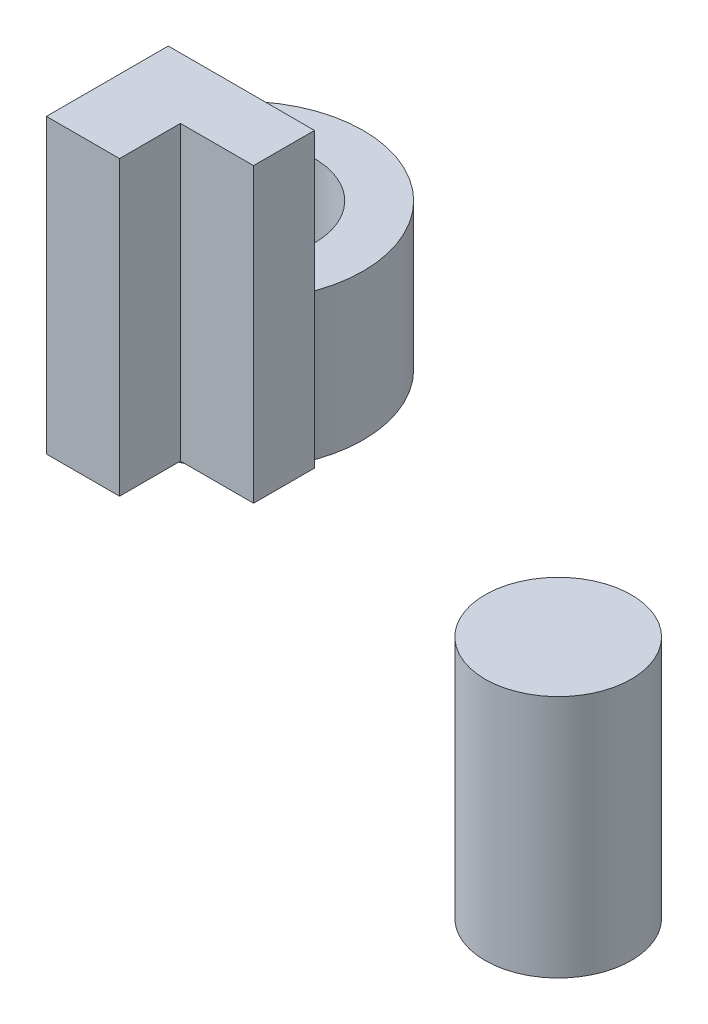
ISO-10303-21;
HEADER;
FILE_DESCRIPTION(('STEP AP214'),'2;1');
FILE_NAME('part.step','',(''),(''),'','','');
FILE_SCHEMA(('AUTOMOTIVE_DESIGN { 1 0 10303 214 1 1 1 1 }'));
ENDSEC;
DATA;
#1=APPLICATION_CONTEXT('core data for automotive mechanical design processes');
#2=APPLICATION_PROTOCOL_DEFINITION('international standard','automotive_design',2000,#1);
#3=PRODUCT_CONTEXT('',#1,'mechanical');
#4=PRODUCT('Part','Part','',(#3));
#5=PRODUCT_RELATED_PRODUCT_CATEGORY('part','',(#4));
#6=PRODUCT_DEFINITION_FORMATION('','',#4);
#7=PRODUCT_DEFINITION_CONTEXT('part definition',#1,'design');
#8=PRODUCT_DEFINITION('design','',#6,#7);
#9=PRODUCT_DEFINITION_SHAPE('','',#8);
#10=(LENGTH_UNIT() NAMED_UNIT(*) SI_UNIT(.MILLI.,.METRE.));
#11=(NAMED_UNIT(*) PLANE_ANGLE_UNIT() SI_UNIT($,.RADIAN.));
#12=(NAMED_UNIT(*) SI_UNIT($,.STERADIAN.) SOLID_ANGLE_UNIT());
#13=UNCERTAINTY_MEASURE_WITH_UNIT(LENGTH_MEASURE(1.E-05),#10,'distance_accuracy_value','');
#14=(GEOMETRIC_REPRESENTATION_CONTEXT(3) GLOBAL_UNCERTAINTY_ASSIGNED_CONTEXT((#13)) GLOBAL_UNIT_ASSIGNED_CONTEXT((#10,
#11,#12)) REPRESENTATION_CONTEXT('',''));
#15=CARTESIAN_POINT('',(0.,0.,0.));
#16=DIRECTION('',(0.,0.,1.));
#17=DIRECTION('',(1.,0.,0.));
#18=AXIS2_PLACEMENT_3D('',#15,#16,#17);
#19=CARTESIAN_POINT('',(0.,85.8555714935405,0.));
#20=DIRECTION('',(0.,1.,0.));
#21=DIRECTION('',(0.,0.,1.));
#22=AXIS2_PLACEMENT_3D('',#19,#20,#21);
#23=CYLINDRICAL_SURFACE('',#22,15.);
#24=CARTESIAN_POINT('',(0.,15.,0.));
#25=DIRECTION('',(0.,1.,0.));
#26=DIRECTION('',(0.,0.,1.));
#27=AXIS2_PLACEMENT_3D('',#24,#25,#26);
#28=CIRCLE('',#27,15.);
#29=CARTESIAN_POINT('',(0.,15.,15.));
#30=VERTEX_POINT('',#29);
#31=EDGE_CURVE('E11',#30,#30,#28,.T.);
#32=ORIENTED_EDGE('',*,*,#31,.F.);
#33=EDGE_LOOP('',(#32));
#34=FACE_BOUND('',#33,.T.);
#35=CARTESIAN_POINT('',(0.,45.,0.));
#36=DIRECTION('',(0.,1.,0.));
#37=DIRECTION('',(0.,0.,1.));
#38=AXIS2_PLACEMENT_3D('',#35,#36,#37);
#39=CIRCLE('',#38,15.);
#40=CARTESIAN_POINT('',(0.,45.,15.));
#41=VERTEX_POINT('',#40);
#42=EDGE_CURVE('E67',#41,#41,#39,.T.);
#43=ORIENTED_EDGE('',*,*,#42,.T.);
#44=EDGE_LOOP('',(#43));
#45=FACE_BOUND('',#44,.T.);
#46=ADVANCED_FACE('F50',(#34,#45),#23,.F.);
#47=CARTESIAN_POINT('',(15.,15.,0.));
#48=DIRECTION('',(0.,1.,0.));
#49=DIRECTION('',(0.,0.,1.));
#50=AXIS2_PLACEMENT_3D('',#47,#48,#49);
#51=PLANE('',#50);
#52=CARTESIAN_POINT('',(0.,15.,0.));
#53=DIRECTION('',(0.,1.,0.));
#54=DIRECTION('',(0.,0.,1.));
#55=AXIS2_PLACEMENT_3D('',#52,#53,#54);
#56=CIRCLE('',#55,25.);
#57=CARTESIAN_POINT('',(0.,15.,25.));
#58=VERTEX_POINT('',#57);
#59=EDGE_CURVE('E57',#58,#58,#56,.T.);
#60=ORIENTED_EDGE('',*,*,#59,.F.);
#61=EDGE_LOOP('',(#60));
#62=FACE_BOUND('',#61,.T.);
#63=ORIENTED_EDGE('',*,*,#31,.T.);
#64=EDGE_LOOP('',(#63));
#65=FACE_BOUND('',#64,.T.);
#66=ADVANCED_FACE('F83',(#62,#65),#51,.F.);
#67=CARTESIAN_POINT('',(0.,85.8555714935405,0.));
#68=DIRECTION('',(0.,1.,0.));
#69=DIRECTION('',(0.,0.,1.));
#70=AXIS2_PLACEMENT_3D('',#67,#68,#69);
#71=CYLINDRICAL_SURFACE('',#70,25.);
#72=CARTESIAN_POINT('',(0.,45.,0.));
#73=DIRECTION('',(0.,1.,0.));
#74=DIRECTION('',(0.,0.,1.));
#75=AXIS2_PLACEMENT_3D('',#72,#73,#74);
#76=CIRCLE('',#75,25.);
#77=CARTESIAN_POINT('',(0.,45.,25.));
#78=VERTEX_POINT('',#77);
#79=EDGE_CURVE('E62',#78,#78,#76,.T.);
#80=ORIENTED_EDGE('',*,*,#79,.F.);
#81=EDGE_LOOP('',(#80));
#82=FACE_BOUND('',#81,.T.);
#83=ORIENTED_EDGE('',*,*,#59,.T.);
#84=EDGE_LOOP('',(#83));
#85=FACE_BOUND('',#84,.T.);
#86=ADVANCED_FACE('F78',(#82,#85),#71,.T.);
#87=CARTESIAN_POINT('',(15.,45.,0.));
#88=DIRECTION('',(0.,-1.,0.));
#89=DIRECTION('',(0.,0.,-1.));
#90=AXIS2_PLACEMENT_3D('',#87,#88,#89);
#91=PLANE('',#90);
#92=ORIENTED_EDGE('',*,*,#42,.F.);
#93=EDGE_LOOP('',(#92));
#94=FACE_BOUND('',#93,.T.);
#95=ORIENTED_EDGE('',*,*,#79,.T.);
#96=EDGE_LOOP('',(#95));
#97=FACE_BOUND('',#96,.T.);
#98=ADVANCED_FACE('F75',(#94,#97),#91,.F.);
#99=CLOSED_SHELL('',(#46,#66,#86,#98));
#100=MANIFOLD_SOLID_BREP('B2',#99);
#101=CARTESIAN_POINT('',(100.,35.,35.));
#102=DIRECTION('',(0.,-1.,0.));
#103=DIRECTION('',(0.,0.,-1.));
#104=AXIS2_PLACEMENT_3D('',#101,#102,#103);
#105=CYLINDRICAL_SURFACE('',#104,15.);
#106=CARTESIAN_POINT('',(100.,35.,35.));
#107=DIRECTION('',(0.,1.,0.));
#108=DIRECTION('',(0.,0.,1.));
#109=AXIS2_PLACEMENT_3D('',#106,#107,#108);
#110=CIRCLE('',#109,15.);
#111=CARTESIAN_POINT('',(100.,35.,50.));
#112=VERTEX_POINT('',#111);
#113=EDGE_CURVE('E49',#112,#112,#110,.T.);
#114=ORIENTED_EDGE('',*,*,#113,.F.);
#115=EDGE_LOOP('',(#114));
#116=FACE_BOUND('',#115,.T.);
#117=CARTESIAN_POINT('',(100.,-15.,35.));
#118=DIRECTION('',(0.,1.,0.));
#119=DIRECTION('',(0.,0.,1.));
#120=AXIS2_PLACEMENT_3D('',#117,#118,#119);
#121=CIRCLE('',#120,15.);
#122=CARTESIAN_POINT('',(100.,-15.,50.));
#123=VERTEX_POINT('',#122);
#124=EDGE_CURVE('E128',#123,#123,#121,.T.);
#125=ORIENTED_EDGE('',*,*,#124,.T.);
#126=EDGE_LOOP('',(#125));
#127=FACE_BOUND('',#126,.T.);
#128=ADVANCED_FACE('F125',(#116,#127),#105,.T.);
#129=CARTESIAN_POINT('',(100.,35.,35.));
#130=DIRECTION('',(0.,1.,0.));
#131=DIRECTION('',(0.,0.,1.));
#132=AXIS2_PLACEMENT_3D('',#129,#130,#131);
#133=PLANE('',#132);
#134=ORIENTED_EDGE('',*,*,#113,.T.);
#135=EDGE_LOOP('',(#134));
#136=FACE_BOUND('',#135,.T.);
#137=ADVANCED_FACE('F140',(#136),#133,.T.);
#138=CARTESIAN_POINT('',(100.,-15.,35.));
#139=DIRECTION('',(0.,1.,0.));
#140=DIRECTION('',(0.,0.,1.));
#141=AXIS2_PLACEMENT_3D('',#138,#139,#140);
#142=PLANE('',#141);
#143=ORIENTED_EDGE('',*,*,#124,.F.);
#144=EDGE_LOOP('',(#143));
#145=FACE_BOUND('',#144,.T.);
#146=ADVANCED_FACE('F138',(#145),#142,.F.);
#147=CLOSED_SHELL('',(#128,#137,#146));
#148=MANIFOLD_SOLID_BREP('B6',#147);
#149=CARTESIAN_POINT('',(35.,100.,0.));
#150=DIRECTION('',(-1.,0.,0.));
#151=DIRECTION('',(0.,0.,1.));
#152=AXIS2_PLACEMENT_3D('',#149,#150,#151);
#153=PLANE('',#152);
#154=DIRECTION('',(0.,0.,-1.));
#155=VECTOR('',#154,1.);
#156=CARTESIAN_POINT('',(35.,40.,0.));
#157=LINE('',#156,#155);
#158=CARTESIAN_POINT('',(35.,40.,60.));
#159=VERTEX_POINT('',#158);
#160=CARTESIAN_POINT('',(35.,40.,47.5));
#161=VERTEX_POINT('',#160);
#162=EDGE_CURVE('E250',#159,#161,#157,.T.);
#163=ORIENTED_EDGE('',*,*,#162,.T.);
#164=DIRECTION('',(0.,-1.,0.));
#165=VECTOR('',#164,1.);
#166=CARTESIAN_POINT('',(35.,100.,47.5));
#167=LINE('',#166,#165);
#168=CARTESIAN_POINT('',(35.,100.,47.5));
#169=VERTEX_POINT('',#168);
#170=EDGE_CURVE('E123',#169,#161,#167,.T.);
#171=ORIENTED_EDGE('',*,*,#170,.F.);
#172=DIRECTION('',(0.,0.,-1.));
#173=VECTOR('',#172,1.);
#174=CARTESIAN_POINT('',(35.,100.,0.));
#175=LINE('',#174,#173);
#176=CARTESIAN_POINT('',(35.,100.,60.));
#177=VERTEX_POINT('',#176);
#178=EDGE_CURVE('E262',#177,#169,#175,.T.);
#179=ORIENTED_EDGE('',*,*,#178,.F.);
#180=DIRECTION('',(0.,-1.,0.));
#181=VECTOR('',#180,1.);
#182=CARTESIAN_POINT('',(35.,100.,60.));
#183=LINE('',#182,#181);
#184=EDGE_CURVE('E249',#177,#159,#183,.T.);
#185=ORIENTED_EDGE('',*,*,#184,.T.);
#186=EDGE_LOOP('',(#163,#171,#179,#185));
#187=FACE_BOUND('',#186,.T.);
#188=ADVANCED_FACE('F166',(#187),#153,.F.);
#189=CARTESIAN_POINT('',(0.,100.,47.5));
#190=DIRECTION('',(0.,0.,-1.));
#191=DIRECTION('',(-1.,0.,0.));
#192=AXIS2_PLACEMENT_3D('',#189,#190,#191);
#193=PLANE('',#192);
#194=DIRECTION('',(1.,0.,0.));
#195=VECTOR('',#194,1.);
#196=CARTESIAN_POINT('',(0.,40.,47.5));
#197=LINE('',#196,#195);
#198=CARTESIAN_POINT('',(50.,40.,47.5));
#199=VERTEX_POINT('',#198);
#200=EDGE_CURVE('E253',#161,#199,#197,.T.);
#201=ORIENTED_EDGE('',*,*,#200,.T.);
#202=DIRECTION('',(0.,-1.,0.));
#203=VECTOR('',#202,1.);
#204=CARTESIAN_POINT('',(50.,100.,47.5));
#205=LINE('',#204,#203);
#206=CARTESIAN_POINT('',(50.,100.,47.5));
#207=VERTEX_POINT('',#206);
#208=EDGE_CURVE('E174',#207,#199,#205,.T.);
#209=ORIENTED_EDGE('',*,*,#208,.F.);
#210=DIRECTION('',(1.,0.,0.));
#211=VECTOR('',#210,1.);
#212=CARTESIAN_POINT('',(0.,100.,47.5));
#213=LINE('',#212,#211);
#214=EDGE_CURVE('E218',#169,#207,#213,.T.);
#215=ORIENTED_EDGE('',*,*,#214,.F.);
#216=ORIENTED_EDGE('',*,*,#170,.T.);
#217=EDGE_LOOP('',(#201,#209,#215,#216));
#218=FACE_BOUND('',#217,.T.);
#219=ADVANCED_FACE('F268',(#218),#193,.F.);
#220=CARTESIAN_POINT('',(50.,100.,0.));
#221=DIRECTION('',(1.,0.,0.));
#222=DIRECTION('',(0.,0.,-1.));
#223=AXIS2_PLACEMENT_3D('',#220,#221,#222);
#224=PLANE('',#223);
#225=DIRECTION('',(0.,0.,1.));
#226=VECTOR('',#225,1.);
#227=CARTESIAN_POINT('',(50.,40.,0.));
#228=LINE('',#227,#226);
#229=CARTESIAN_POINT('',(50.,40.,35.));
#230=VERTEX_POINT('',#229);
#231=EDGE_CURVE('E256',#230,#199,#228,.T.);
#232=ORIENTED_EDGE('',*,*,#231,.F.);
#233=DIRECTION('',(0.,-1.,0.));
#234=VECTOR('',#233,1.);
#235=CARTESIAN_POINT('',(50.,100.,35.));
#236=LINE('',#235,#234);
#237=CARTESIAN_POINT('',(50.,100.,35.));
#238=VERTEX_POINT('',#237);
#239=EDGE_CURVE('E234',#238,#230,#236,.T.);
#240=ORIENTED_EDGE('',*,*,#239,.F.);
#241=DIRECTION('',(0.,0.,1.));
#242=VECTOR('',#241,1.);
#243=CARTESIAN_POINT('',(50.,100.,0.));
#244=LINE('',#243,#242);
#245=EDGE_CURVE('E243',#238,#207,#244,.T.);
#246=ORIENTED_EDGE('',*,*,#245,.T.);
#247=ORIENTED_EDGE('',*,*,#208,.T.);
#248=EDGE_LOOP('',(#232,#240,#246,#247));
#249=FACE_BOUND('',#248,.T.);
#250=ADVANCED_FACE('F267',(#249),#224,.T.);
#251=CARTESIAN_POINT('',(0.,100.,35.));
#252=DIRECTION('',(0.,0.,-1.));
#253=DIRECTION('',(-1.,0.,0.));
#254=AXIS2_PLACEMENT_3D('',#251,#252,#253);
#255=PLANE('',#254);
#256=DIRECTION('',(1.,0.,0.));
#257=VECTOR('',#256,1.);
#258=CARTESIAN_POINT('',(0.,40.,35.));
#259=LINE('',#258,#257);
#260=CARTESIAN_POINT('',(20.,40.,35.));
#261=VERTEX_POINT('',#260);
#262=EDGE_CURVE('E233',#261,#230,#259,.T.);
#263=ORIENTED_EDGE('',*,*,#262,.F.);
#264=DIRECTION('',(0.,-1.,0.));
#265=VECTOR('',#264,1.);
#266=CARTESIAN_POINT('',(20.,100.,35.));
#267=LINE('',#266,#265);
#268=CARTESIAN_POINT('',(20.,100.,35.));
#269=VERTEX_POINT('',#268);
#270=EDGE_CURVE('E227',#269,#261,#267,.T.);
#271=ORIENTED_EDGE('',*,*,#270,.F.);
#272=DIRECTION('',(1.,0.,0.));
#273=VECTOR('',#272,1.);
#274=CARTESIAN_POINT('',(0.,100.,35.));
#275=LINE('',#274,#273);
#276=EDGE_CURVE('E231',#269,#238,#275,.T.);
#277=ORIENTED_EDGE('',*,*,#276,.T.);
#278=ORIENTED_EDGE('',*,*,#239,.T.);
#279=EDGE_LOOP('',(#263,#271,#277,#278));
#280=FACE_BOUND('',#279,.T.);
#281=ADVANCED_FACE('F229',(#280),#255,.T.);
#282=CARTESIAN_POINT('',(20.,100.,0.));
#283=DIRECTION('',(1.,0.,0.));
#284=DIRECTION('',(0.,0.,-1.));
#285=AXIS2_PLACEMENT_3D('',#282,#283,#284);
#286=PLANE('',#285);
#287=DIRECTION('',(0.,0.,1.));
#288=VECTOR('',#287,1.);
#289=CARTESIAN_POINT('',(20.,40.,0.));
#290=LINE('',#289,#288);
#291=CARTESIAN_POINT('',(20.,40.,60.));
#292=VERTEX_POINT('',#291);
#293=EDGE_CURVE('E204',#261,#292,#290,.T.);
#294=ORIENTED_EDGE('',*,*,#293,.T.);
#295=DIRECTION('',(0.,-1.,0.));
#296=VECTOR('',#295,1.);
#297=CARTESIAN_POINT('',(20.,100.,60.));
#298=LINE('',#297,#296);
#299=CARTESIAN_POINT('',(20.,100.,60.));
#300=VERTEX_POINT('',#299);
#301=EDGE_CURVE('E235',#300,#292,#298,.T.);
#302=ORIENTED_EDGE('',*,*,#301,.F.);
#303=DIRECTION('',(0.,0.,1.));
#304=VECTOR('',#303,1.);
#305=CARTESIAN_POINT('',(20.,100.,0.));
#306=LINE('',#305,#304);
#307=EDGE_CURVE('E237',#269,#300,#306,.T.);
#308=ORIENTED_EDGE('',*,*,#307,.F.);
#309=ORIENTED_EDGE('',*,*,#270,.T.);
#310=EDGE_LOOP('',(#294,#302,#308,#309));
#311=FACE_BOUND('',#310,.T.);
#312=ADVANCED_FACE('F238',(#311),#286,.F.);
#313=CARTESIAN_POINT('',(0.,100.,60.));
#314=DIRECTION('',(0.,0.,-1.));
#315=DIRECTION('',(-1.,0.,0.));
#316=AXIS2_PLACEMENT_3D('',#313,#314,#315);
#317=PLANE('',#316);
#318=DIRECTION('',(1.,0.,0.));
#319=VECTOR('',#318,1.);
#320=CARTESIAN_POINT('',(0.,40.,60.));
#321=LINE('',#320,#319);
#322=EDGE_CURVE('E210',#292,#159,#321,.T.);
#323=ORIENTED_EDGE('',*,*,#322,.T.);
#324=ORIENTED_EDGE('',*,*,#184,.F.);
#325=DIRECTION('',(1.,0.,0.));
#326=VECTOR('',#325,1.);
#327=CARTESIAN_POINT('',(0.,100.,60.));
#328=LINE('',#327,#326);
#329=EDGE_CURVE('E182',#300,#177,#328,.T.);
#330=ORIENTED_EDGE('',*,*,#329,.F.);
#331=ORIENTED_EDGE('',*,*,#301,.T.);
#332=EDGE_LOOP('',(#323,#324,#330,#331));
#333=FACE_BOUND('',#332,.T.);
#334=ADVANCED_FACE('F275',(#333),#317,.F.);
#335=CARTESIAN_POINT('',(0.,100.,0.));
#336=DIRECTION('',(0.,1.,0.));
#337=DIRECTION('',(0.,0.,1.));
#338=AXIS2_PLACEMENT_3D('',#335,#336,#337);
#339=PLANE('',#338);
#340=ORIENTED_EDGE('',*,*,#178,.T.);
#341=ORIENTED_EDGE('',*,*,#214,.T.);
#342=ORIENTED_EDGE('',*,*,#245,.F.);
#343=ORIENTED_EDGE('',*,*,#276,.F.);
#344=ORIENTED_EDGE('',*,*,#307,.T.);
#345=ORIENTED_EDGE('',*,*,#329,.T.);
#346=EDGE_LOOP('',(#340,#341,#342,#343,#344,#345));
#347=FACE_BOUND('',#346,.T.);
#348=ADVANCED_FACE('F241',(#347),#339,.T.);
#349=CARTESIAN_POINT('',(0.,40.,0.));
#350=DIRECTION('',(0.,1.,0.));
#351=DIRECTION('',(0.,0.,1.));
#352=AXIS2_PLACEMENT_3D('',#349,#350,#351);
#353=PLANE('',#352);
#354=ORIENTED_EDGE('',*,*,#162,.F.);
#355=ORIENTED_EDGE('',*,*,#322,.F.);
#356=ORIENTED_EDGE('',*,*,#293,.F.);
#357=ORIENTED_EDGE('',*,*,#262,.T.);
#358=ORIENTED_EDGE('',*,*,#231,.T.);
#359=ORIENTED_EDGE('',*,*,#200,.F.);
#360=EDGE_LOOP('',(#354,#355,#356,#357,#358,#359));
#361=FACE_BOUND('',#360,.T.);
#362=ADVANCED_FACE('F272',(#361),#353,.F.);
#363=CLOSED_SHELL('',(#188,#219,#250,#281,#312,#334,#348,#362));
#364=MANIFOLD_SOLID_BREP('B44',#363);
#365=ADVANCED_BREP_SHAPE_REPRESENTATION('',(#18,#100,#148,#364),#14);
#366=SHAPE_DEFINITION_REPRESENTATION(#9,#365);
ENDSEC;
END-ISO-10303-21;
